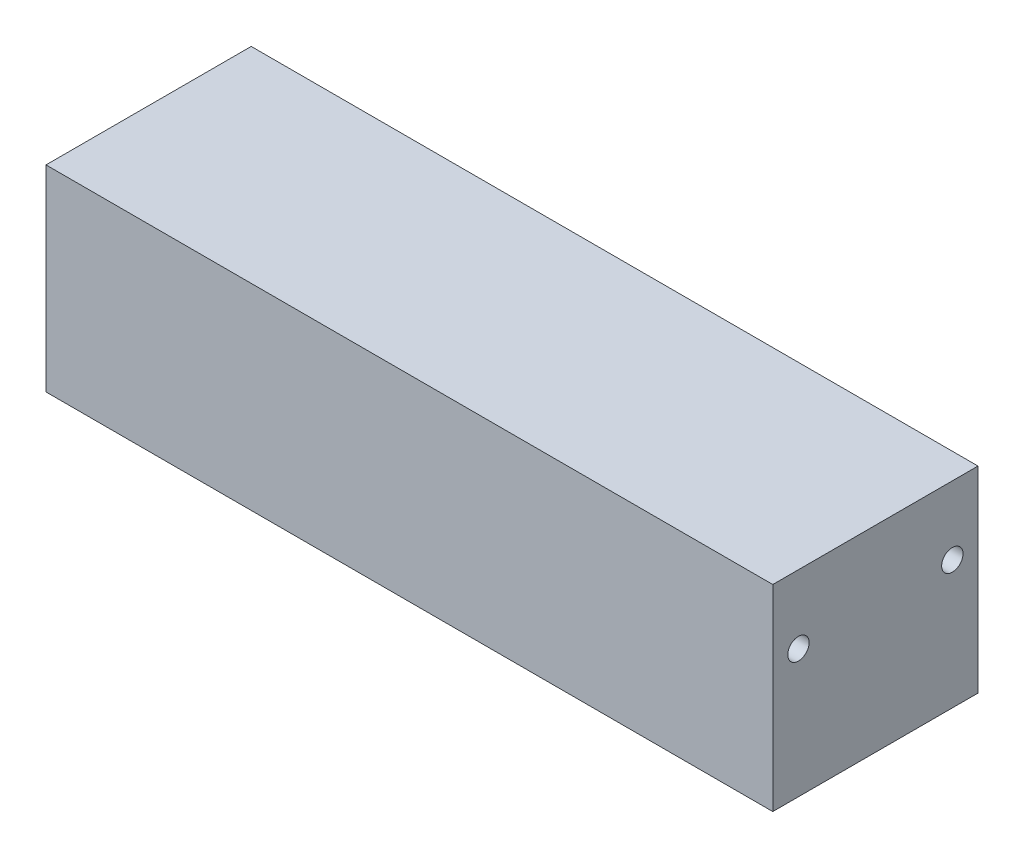
ISO-10303-21;
HEADER;
FILE_DESCRIPTION(('STEP AP214'),'2;1');
FILE_NAME('part.step','',(''),(''),'','','');
FILE_SCHEMA(('AUTOMOTIVE_DESIGN { 1 0 10303 214 1 1 1 1 }'));
ENDSEC;
DATA;
#1=APPLICATION_CONTEXT('core data for automotive mechanical design processes');
#2=APPLICATION_PROTOCOL_DEFINITION('international standard','automotive_design',2000,#1);
#3=PRODUCT_CONTEXT('',#1,'mechanical');
#4=PRODUCT('Part','Part','',(#3));
#5=PRODUCT_RELATED_PRODUCT_CATEGORY('part','',(#4));
#6=PRODUCT_DEFINITION_FORMATION('','',#4);
#7=PRODUCT_DEFINITION_CONTEXT('part definition',#1,'design');
#8=PRODUCT_DEFINITION('design','',#6,#7);
#9=PRODUCT_DEFINITION_SHAPE('','',#8);
#10=(LENGTH_UNIT() NAMED_UNIT(*) SI_UNIT(.MILLI.,.METRE.));
#11=(NAMED_UNIT(*) PLANE_ANGLE_UNIT() SI_UNIT($,.RADIAN.));
#12=(NAMED_UNIT(*) SI_UNIT($,.STERADIAN.) SOLID_ANGLE_UNIT());
#13=UNCERTAINTY_MEASURE_WITH_UNIT(LENGTH_MEASURE(1.E-05),#10,'distance_accuracy_value','');
#14=(GEOMETRIC_REPRESENTATION_CONTEXT(3) GLOBAL_UNCERTAINTY_ASSIGNED_CONTEXT((#13)) GLOBAL_UNIT_ASSIGNED_CONTEXT((#10,
#11,#12)) REPRESENTATION_CONTEXT('',''));
#15=CARTESIAN_POINT('',(0.,0.,0.));
#16=DIRECTION('',(0.,0.,1.));
#17=DIRECTION('',(1.,0.,0.));
#18=AXIS2_PLACEMENT_3D('',#15,#16,#17);
#19=CARTESIAN_POINT('',(-42.5,-11.5,24.));
#20=DIRECTION('',(1.,0.,0.));
#21=DIRECTION('',(0.,0.,-1.));
#22=AXIS2_PLACEMENT_3D('',#19,#20,#21);
#23=PLANE('',#22);
#24=CARTESIAN_POINT('',(-42.5,3.5,3.));
#25=DIRECTION('',(1.,0.,0.));
#26=DIRECTION('',(0.,0.,-1.));
#27=AXIS2_PLACEMENT_3D('',#24,#25,#26);
#28=CIRCLE('',#27,1.25);
#29=CARTESIAN_POINT('',(-42.5,3.5,1.75));
#30=VERTEX_POINT('',#29);
#31=EDGE_CURVE('E135',#30,#30,#28,.T.);
#32=ORIENTED_EDGE('',*,*,#31,.T.);
#33=EDGE_LOOP('',(#32));
#34=FACE_BOUND('',#33,.T.);
#35=CARTESIAN_POINT('',(-42.5,3.5,21.));
#36=DIRECTION('',(1.,0.,0.));
#37=DIRECTION('',(0.,0.,1.));
#38=AXIS2_PLACEMENT_3D('',#35,#36,#37);
#39=CIRCLE('',#38,1.25);
#40=CARTESIAN_POINT('',(-42.5,3.5,22.25));
#41=VERTEX_POINT('',#40);
#42=EDGE_CURVE('E138',#41,#41,#39,.T.);
#43=ORIENTED_EDGE('',*,*,#42,.T.);
#44=EDGE_LOOP('',(#43));
#45=FACE_BOUND('',#44,.T.);
#46=DIRECTION('',(0.,-1.,0.));
#47=VECTOR('',#46,1.);
#48=CARTESIAN_POINT('',(-42.5,-11.5,0.));
#49=LINE('',#48,#47);
#50=CARTESIAN_POINT('',(-42.5,11.5,0.));
#51=VERTEX_POINT('',#50);
#52=CARTESIAN_POINT('',(-42.5,-11.5,0.));
#53=VERTEX_POINT('',#52);
#54=EDGE_CURVE('E101',#51,#53,#49,.T.);
#55=ORIENTED_EDGE('',*,*,#54,.T.);
#56=DIRECTION('',(0.,0.,-1.));
#57=VECTOR('',#56,1.);
#58=CARTESIAN_POINT('',(-42.5,-11.5,24.));
#59=LINE('',#58,#57);
#60=CARTESIAN_POINT('',(-42.5,-11.5,24.));
#61=VERTEX_POINT('',#60);
#62=EDGE_CURVE('E43',#61,#53,#59,.T.);
#63=ORIENTED_EDGE('',*,*,#62,.F.);
#64=DIRECTION('',(0.,-1.,0.));
#65=VECTOR('',#64,1.);
#66=CARTESIAN_POINT('',(-42.5,-11.5,24.));
#67=LINE('',#66,#65);
#68=CARTESIAN_POINT('',(-42.5,11.5,24.));
#69=VERTEX_POINT('',#68);
#70=EDGE_CURVE('E87',#69,#61,#67,.T.);
#71=ORIENTED_EDGE('',*,*,#70,.F.);
#72=DIRECTION('',(0.,0.,-1.));
#73=VECTOR('',#72,1.);
#74=CARTESIAN_POINT('',(-42.5,11.5,24.));
#75=LINE('',#74,#73);
#76=EDGE_CURVE('E97',#69,#51,#75,.T.);
#77=ORIENTED_EDGE('',*,*,#76,.T.);
#78=EDGE_LOOP('',(#55,#63,#71,#77));
#79=FACE_BOUND('',#78,.T.);
#80=ADVANCED_FACE('F35',(#34,#45,#79),#23,.F.);
#81=CARTESIAN_POINT('',(42.5,-11.5,24.));
#82=DIRECTION('',(0.,1.,0.));
#83=DIRECTION('',(-1.,0.,0.));
#84=AXIS2_PLACEMENT_3D('',#81,#82,#83);
#85=PLANE('',#84);
#86=CARTESIAN_POINT('',(-34.5,-11.5,12.));
#87=DIRECTION('',(0.,1.,0.));
#88=DIRECTION('',(-1.,0.,0.));
#89=AXIS2_PLACEMENT_3D('',#86,#87,#88);
#90=CIRCLE('',#89,2.);
#91=CARTESIAN_POINT('',(-36.5,-11.5,12.));
#92=VERTEX_POINT('',#91);
#93=EDGE_CURVE('E11',#92,#92,#90,.F.);
#94=ORIENTED_EDGE('',*,*,#93,.F.);
#95=EDGE_LOOP('',(#94));
#96=FACE_BOUND('',#95,.T.);
#97=CARTESIAN_POINT('',(-25.,-11.5,12.));
#98=DIRECTION('',(0.,-1.,0.));
#99=DIRECTION('',(1.,0.,0.));
#100=AXIS2_PLACEMENT_3D('',#97,#98,#99);
#101=CIRCLE('',#100,1.25);
#102=CARTESIAN_POINT('',(-23.75,-11.5,12.));
#103=VERTEX_POINT('',#102);
#104=EDGE_CURVE('E165',#103,#103,#101,.T.);
#105=ORIENTED_EDGE('',*,*,#104,.F.);
#106=EDGE_LOOP('',(#105));
#107=FACE_BOUND('',#106,.T.);
#108=CARTESIAN_POINT('',(25.,-11.5,12.));
#109=DIRECTION('',(0.,-1.,0.));
#110=DIRECTION('',(1.,0.,0.));
#111=AXIS2_PLACEMENT_3D('',#108,#109,#110);
#112=CIRCLE('',#111,1.25);
#113=CARTESIAN_POINT('',(26.25,-11.5,12.));
#114=VERTEX_POINT('',#113);
#115=EDGE_CURVE('E152',#114,#114,#112,.T.);
#116=ORIENTED_EDGE('',*,*,#115,.F.);
#117=EDGE_LOOP('',(#116));
#118=FACE_BOUND('',#117,.T.);
#119=DIRECTION('',(1.,0.,0.));
#120=VECTOR('',#119,1.);
#121=CARTESIAN_POINT('',(42.5,-11.5,0.));
#122=LINE('',#121,#120);
#123=CARTESIAN_POINT('',(42.5,-11.5,0.));
#124=VERTEX_POINT('',#123);
#125=EDGE_CURVE('E92',#53,#124,#122,.T.);
#126=ORIENTED_EDGE('',*,*,#125,.T.);
#127=DIRECTION('',(0.,0.,-1.));
#128=VECTOR('',#127,1.);
#129=CARTESIAN_POINT('',(42.5,-11.5,24.));
#130=LINE('',#129,#128);
#131=CARTESIAN_POINT('',(42.5,-11.5,24.));
#132=VERTEX_POINT('',#131);
#133=EDGE_CURVE('E90',#132,#124,#130,.T.);
#134=ORIENTED_EDGE('',*,*,#133,.F.);
#135=DIRECTION('',(1.,0.,0.));
#136=VECTOR('',#135,1.);
#137=CARTESIAN_POINT('',(42.5,-11.5,24.));
#138=LINE('',#137,#136);
#139=EDGE_CURVE('E82',#61,#132,#138,.T.);
#140=ORIENTED_EDGE('',*,*,#139,.F.);
#141=ORIENTED_EDGE('',*,*,#62,.T.);
#142=EDGE_LOOP('',(#126,#134,#140,#141));
#143=FACE_BOUND('',#142,.T.);
#144=ADVANCED_FACE('F91',(#96,#107,#118,#143),#85,.F.);
#145=CARTESIAN_POINT('',(42.5,-11.5,24.));
#146=DIRECTION('',(-1.,0.,0.));
#147=DIRECTION('',(0.,0.,1.));
#148=AXIS2_PLACEMENT_3D('',#145,#146,#147);
#149=PLANE('',#148);
#150=CARTESIAN_POINT('',(42.5,3.5,3.));
#151=DIRECTION('',(1.,0.,0.));
#152=DIRECTION('',(0.,0.,-1.));
#153=AXIS2_PLACEMENT_3D('',#150,#151,#152);
#154=CIRCLE('',#153,1.25);
#155=CARTESIAN_POINT('',(42.5,3.5,1.75));
#156=VERTEX_POINT('',#155);
#157=EDGE_CURVE('E153',#156,#156,#154,.T.);
#158=ORIENTED_EDGE('',*,*,#157,.F.);
#159=EDGE_LOOP('',(#158));
#160=FACE_BOUND('',#159,.T.);
#161=CARTESIAN_POINT('',(42.5,3.5,21.));
#162=DIRECTION('',(1.,0.,0.));
#163=DIRECTION('',(0.,0.,1.));
#164=AXIS2_PLACEMENT_3D('',#161,#162,#163);
#165=CIRCLE('',#164,1.25);
#166=CARTESIAN_POINT('',(42.5,3.5,22.25));
#167=VERTEX_POINT('',#166);
#168=EDGE_CURVE('E159',#167,#167,#165,.T.);
#169=ORIENTED_EDGE('',*,*,#168,.F.);
#170=EDGE_LOOP('',(#169));
#171=FACE_BOUND('',#170,.T.);
#172=DIRECTION('',(0.,1.,0.));
#173=VECTOR('',#172,1.);
#174=CARTESIAN_POINT('',(42.5,-11.5,0.));
#175=LINE('',#174,#173);
#176=CARTESIAN_POINT('',(42.5,11.5,0.));
#177=VERTEX_POINT('',#176);
#178=EDGE_CURVE('E68',#124,#177,#175,.T.);
#179=ORIENTED_EDGE('',*,*,#178,.T.);
#180=DIRECTION('',(0.,0.,-1.));
#181=VECTOR('',#180,1.);
#182=CARTESIAN_POINT('',(42.5,11.5,24.));
#183=LINE('',#182,#181);
#184=CARTESIAN_POINT('',(42.5,11.5,24.));
#185=VERTEX_POINT('',#184);
#186=EDGE_CURVE('E93',#185,#177,#183,.T.);
#187=ORIENTED_EDGE('',*,*,#186,.F.);
#188=DIRECTION('',(0.,1.,0.));
#189=VECTOR('',#188,1.);
#190=CARTESIAN_POINT('',(42.5,-11.5,24.));
#191=LINE('',#190,#189);
#192=EDGE_CURVE('E85',#132,#185,#191,.T.);
#193=ORIENTED_EDGE('',*,*,#192,.F.);
#194=ORIENTED_EDGE('',*,*,#133,.T.);
#195=EDGE_LOOP('',(#179,#187,#193,#194));
#196=FACE_BOUND('',#195,.T.);
#197=ADVANCED_FACE('F95',(#160,#171,#196),#149,.F.);
#198=CARTESIAN_POINT('',(42.5,11.5,24.));
#199=DIRECTION('',(0.,-1.,0.));
#200=DIRECTION('',(1.,0.,0.));
#201=AXIS2_PLACEMENT_3D('',#198,#199,#200);
#202=PLANE('',#201);
#203=DIRECTION('',(-1.,0.,0.));
#204=VECTOR('',#203,1.);
#205=CARTESIAN_POINT('',(42.5,11.5,0.));
#206=LINE('',#205,#204);
#207=EDGE_CURVE('E74',#177,#51,#206,.T.);
#208=ORIENTED_EDGE('',*,*,#207,.T.);
#209=ORIENTED_EDGE('',*,*,#76,.F.);
#210=DIRECTION('',(-1.,0.,0.));
#211=VECTOR('',#210,1.);
#212=CARTESIAN_POINT('',(42.5,11.5,24.));
#213=LINE('',#212,#211);
#214=EDGE_CURVE('E51',#185,#69,#213,.T.);
#215=ORIENTED_EDGE('',*,*,#214,.F.);
#216=ORIENTED_EDGE('',*,*,#186,.T.);
#217=EDGE_LOOP('',(#208,#209,#215,#216));
#218=FACE_BOUND('',#217,.T.);
#219=ADVANCED_FACE('F123',(#218),#202,.F.);
#220=CARTESIAN_POINT('',(0.,0.,24.));
#221=DIRECTION('',(0.,0.,1.));
#222=DIRECTION('',(1.,0.,0.));
#223=AXIS2_PLACEMENT_3D('',#220,#221,#222);
#224=PLANE('',#223);
#225=ORIENTED_EDGE('',*,*,#70,.T.);
#226=ORIENTED_EDGE('',*,*,#139,.T.);
#227=ORIENTED_EDGE('',*,*,#192,.T.);
#228=ORIENTED_EDGE('',*,*,#214,.T.);
#229=EDGE_LOOP('',(#225,#226,#227,#228));
#230=FACE_BOUND('',#229,.T.);
#231=ADVANCED_FACE('F83',(#230),#224,.T.);
#232=CARTESIAN_POINT('',(0.,0.,0.));
#233=DIRECTION('',(0.,0.,1.));
#234=DIRECTION('',(1.,0.,0.));
#235=AXIS2_PLACEMENT_3D('',#232,#233,#234);
#236=PLANE('',#235);
#237=ORIENTED_EDGE('',*,*,#54,.F.);
#238=ORIENTED_EDGE('',*,*,#207,.F.);
#239=ORIENTED_EDGE('',*,*,#178,.F.);
#240=ORIENTED_EDGE('',*,*,#125,.F.);
#241=EDGE_LOOP('',(#237,#238,#239,#240));
#242=FACE_BOUND('',#241,.T.);
#243=ADVANCED_FACE('F112',(#242),#236,.F.);
#244=CARTESIAN_POINT('',(25.,-7.5,12.));
#245=DIRECTION('',(0.,-1.,0.));
#246=DIRECTION('',(1.,0.,0.));
#247=AXIS2_PLACEMENT_3D('',#244,#245,#246);
#248=CYLINDRICAL_SURFACE('',#247,1.25);
#249=CARTESIAN_POINT('',(25.,-7.5,12.));
#250=DIRECTION('',(0.,-1.,0.));
#251=DIRECTION('',(1.,0.,0.));
#252=AXIS2_PLACEMENT_3D('',#249,#250,#251);
#253=CIRCLE('',#252,1.25);
#254=CARTESIAN_POINT('',(26.25,-7.5,12.));
#255=VERTEX_POINT('',#254);
#256=EDGE_CURVE('E168',#255,#255,#253,.T.);
#257=ORIENTED_EDGE('',*,*,#256,.F.);
#258=EDGE_LOOP('',(#257));
#259=FACE_BOUND('',#258,.T.);
#260=ORIENTED_EDGE('',*,*,#115,.T.);
#261=EDGE_LOOP('',(#260));
#262=FACE_BOUND('',#261,.T.);
#263=ADVANCED_FACE('F114',(#259,#262),#248,.F.);
#264=CARTESIAN_POINT('',(25.,-7.5,12.));
#265=DIRECTION('',(0.,-1.,0.));
#266=DIRECTION('',(1.,0.,0.));
#267=AXIS2_PLACEMENT_3D('',#264,#265,#266);
#268=PLANE('',#267);
#269=ORIENTED_EDGE('',*,*,#256,.T.);
#270=EDGE_LOOP('',(#269));
#271=FACE_BOUND('',#270,.T.);
#272=ADVANCED_FACE('F120',(#271),#268,.T.);
#273=CARTESIAN_POINT('',(-25.,-7.50000000000001,12.));
#274=DIRECTION('',(0.,-1.,0.));
#275=DIRECTION('',(1.,0.,0.));
#276=AXIS2_PLACEMENT_3D('',#273,#274,#275);
#277=CYLINDRICAL_SURFACE('',#276,1.25);
#278=CARTESIAN_POINT('',(-25.,-7.50000000000001,12.));
#279=DIRECTION('',(0.,-1.,0.));
#280=DIRECTION('',(1.,0.,0.));
#281=AXIS2_PLACEMENT_3D('',#278,#279,#280);
#282=CIRCLE('',#281,1.25);
#283=CARTESIAN_POINT('',(-23.75,-7.50000000000001,12.));
#284=VERTEX_POINT('',#283);
#285=EDGE_CURVE('E104',#284,#284,#282,.T.);
#286=ORIENTED_EDGE('',*,*,#285,.F.);
#287=EDGE_LOOP('',(#286));
#288=FACE_BOUND('',#287,.T.);
#289=ORIENTED_EDGE('',*,*,#104,.T.);
#290=EDGE_LOOP('',(#289));
#291=FACE_BOUND('',#290,.T.);
#292=ADVANCED_FACE('F178',(#288,#291),#277,.F.);
#293=CARTESIAN_POINT('',(-25.,-7.50000000000001,12.));
#294=DIRECTION('',(0.,-1.,0.));
#295=DIRECTION('',(1.,0.,0.));
#296=AXIS2_PLACEMENT_3D('',#293,#294,#295);
#297=PLANE('',#296);
#298=ORIENTED_EDGE('',*,*,#285,.T.);
#299=EDGE_LOOP('',(#298));
#300=FACE_BOUND('',#299,.T.);
#301=ADVANCED_FACE('F183',(#300),#297,.T.);
#302=CARTESIAN_POINT('',(38.5,3.5,21.));
#303=DIRECTION('',(1.,0.,0.));
#304=DIRECTION('',(0.,0.,-1.));
#305=AXIS2_PLACEMENT_3D('',#302,#303,#304);
#306=CYLINDRICAL_SURFACE('',#305,1.25);
#307=CARTESIAN_POINT('',(38.5,3.5,21.));
#308=DIRECTION('',(1.,0.,0.));
#309=DIRECTION('',(0.,0.,1.));
#310=AXIS2_PLACEMENT_3D('',#307,#308,#309);
#311=CIRCLE('',#310,1.25);
#312=CARTESIAN_POINT('',(38.5,3.5,22.25));
#313=VERTEX_POINT('',#312);
#314=EDGE_CURVE('E156',#313,#313,#311,.T.);
#315=ORIENTED_EDGE('',*,*,#314,.F.);
#316=EDGE_LOOP('',(#315));
#317=FACE_BOUND('',#316,.T.);
#318=ORIENTED_EDGE('',*,*,#168,.T.);
#319=EDGE_LOOP('',(#318));
#320=FACE_BOUND('',#319,.T.);
#321=ADVANCED_FACE('F189',(#317,#320),#306,.F.);
#322=CARTESIAN_POINT('',(38.5,3.5,21.));
#323=DIRECTION('',(-1.,0.,0.));
#324=DIRECTION('',(0.,0.,1.));
#325=AXIS2_PLACEMENT_3D('',#322,#323,#324);
#326=PLANE('',#325);
#327=ORIENTED_EDGE('',*,*,#314,.T.);
#328=EDGE_LOOP('',(#327));
#329=FACE_BOUND('',#328,.T.);
#330=ADVANCED_FACE('F193',(#329),#326,.F.);
#331=CARTESIAN_POINT('',(38.5,3.5,3.));
#332=DIRECTION('',(1.,0.,0.));
#333=DIRECTION('',(0.,0.,-1.));
#334=AXIS2_PLACEMENT_3D('',#331,#332,#333);
#335=CYLINDRICAL_SURFACE('',#334,1.25);
#336=CARTESIAN_POINT('',(38.5,3.5,3.));
#337=DIRECTION('',(1.,0.,0.));
#338=DIRECTION('',(0.,0.,-1.));
#339=AXIS2_PLACEMENT_3D('',#336,#337,#338);
#340=CIRCLE('',#339,1.25);
#341=CARTESIAN_POINT('',(38.5,3.5,1.75));
#342=VERTEX_POINT('',#341);
#343=EDGE_CURVE('E149',#342,#342,#340,.T.);
#344=ORIENTED_EDGE('',*,*,#343,.F.);
#345=EDGE_LOOP('',(#344));
#346=FACE_BOUND('',#345,.T.);
#347=ORIENTED_EDGE('',*,*,#157,.T.);
#348=EDGE_LOOP('',(#347));
#349=FACE_BOUND('',#348,.T.);
#350=ADVANCED_FACE('F197',(#346,#349),#335,.F.);
#351=CARTESIAN_POINT('',(38.5,3.5,3.));
#352=DIRECTION('',(1.,0.,0.));
#353=DIRECTION('',(0.,0.,-1.));
#354=AXIS2_PLACEMENT_3D('',#351,#352,#353);
#355=PLANE('',#354);
#356=ORIENTED_EDGE('',*,*,#343,.T.);
#357=EDGE_LOOP('',(#356));
#358=FACE_BOUND('',#357,.T.);
#359=ADVANCED_FACE('F201',(#358),#355,.T.);
#360=CARTESIAN_POINT('',(-38.5,3.5,21.));
#361=DIRECTION('',(-1.,0.,0.));
#362=DIRECTION('',(0.,0.,1.));
#363=AXIS2_PLACEMENT_3D('',#360,#361,#362);
#364=CYLINDRICAL_SURFACE('',#363,1.25);
#365=CARTESIAN_POINT('',(-38.5,3.5,21.));
#366=DIRECTION('',(1.,0.,0.));
#367=DIRECTION('',(0.,0.,1.));
#368=AXIS2_PLACEMENT_3D('',#365,#366,#367);
#369=CIRCLE('',#368,1.25);
#370=CARTESIAN_POINT('',(-38.5,3.5,22.25));
#371=VERTEX_POINT('',#370);
#372=EDGE_CURVE('E140',#371,#371,#369,.T.);
#373=ORIENTED_EDGE('',*,*,#372,.T.);
#374=EDGE_LOOP('',(#373));
#375=FACE_BOUND('',#374,.T.);
#376=ORIENTED_EDGE('',*,*,#42,.F.);
#377=EDGE_LOOP('',(#376));
#378=FACE_BOUND('',#377,.T.);
#379=ADVANCED_FACE('F205',(#375,#378),#364,.F.);
#380=CARTESIAN_POINT('',(-38.5,3.5,21.));
#381=DIRECTION('',(1.,0.,0.));
#382=DIRECTION('',(0.,0.,1.));
#383=AXIS2_PLACEMENT_3D('',#380,#381,#382);
#384=PLANE('',#383);
#385=ORIENTED_EDGE('',*,*,#372,.F.);
#386=EDGE_LOOP('',(#385));
#387=FACE_BOUND('',#386,.T.);
#388=ADVANCED_FACE('F209',(#387),#384,.F.);
#389=CARTESIAN_POINT('',(-38.5,3.5,3.));
#390=DIRECTION('',(-1.,0.,0.));
#391=DIRECTION('',(0.,0.,1.));
#392=AXIS2_PLACEMENT_3D('',#389,#390,#391);
#393=CYLINDRICAL_SURFACE('',#392,1.25);
#394=CARTESIAN_POINT('',(-38.5,3.5,3.));
#395=DIRECTION('',(1.,0.,0.));
#396=DIRECTION('',(0.,0.,-1.));
#397=AXIS2_PLACEMENT_3D('',#394,#395,#396);
#398=CIRCLE('',#397,1.25);
#399=CARTESIAN_POINT('',(-38.5,3.5,1.75));
#400=VERTEX_POINT('',#399);
#401=EDGE_CURVE('E162',#400,#400,#398,.T.);
#402=ORIENTED_EDGE('',*,*,#401,.T.);
#403=EDGE_LOOP('',(#402));
#404=FACE_BOUND('',#403,.T.);
#405=ORIENTED_EDGE('',*,*,#31,.F.);
#406=EDGE_LOOP('',(#405));
#407=FACE_BOUND('',#406,.T.);
#408=ADVANCED_FACE('F213',(#404,#407),#393,.F.);
#409=CARTESIAN_POINT('',(-38.5,3.5,3.));
#410=DIRECTION('',(-1.,0.,0.));
#411=DIRECTION('',(0.,0.,-1.));
#412=AXIS2_PLACEMENT_3D('',#409,#410,#411);
#413=PLANE('',#412);
#414=ORIENTED_EDGE('',*,*,#401,.F.);
#415=EDGE_LOOP('',(#414));
#416=FACE_BOUND('',#415,.T.);
#417=ADVANCED_FACE('F217',(#416),#413,.T.);
#418=CARTESIAN_POINT('',(-34.5,-21.5,12.));
#419=DIRECTION('',(0.,1.,0.));
#420=DIRECTION('',(-1.,0.,0.));
#421=AXIS2_PLACEMENT_3D('',#418,#419,#420);
#422=CYLINDRICAL_SURFACE('',#421,2.);
#423=CARTESIAN_POINT('',(-34.5,-21.5,12.));
#424=DIRECTION('',(0.,-1.,0.));
#425=DIRECTION('',(1.,0.,0.));
#426=AXIS2_PLACEMENT_3D('',#423,#424,#425);
#427=CIRCLE('',#426,2.);
#428=CARTESIAN_POINT('',(-32.5,-21.5,12.));
#429=VERTEX_POINT('',#428);
#430=EDGE_CURVE('E141',#429,#429,#427,.T.);
#431=ORIENTED_EDGE('',*,*,#430,.F.);
#432=EDGE_LOOP('',(#431));
#433=FACE_BOUND('',#432,.T.);
#434=ORIENTED_EDGE('',*,*,#93,.T.);
#435=EDGE_LOOP('',(#434));
#436=FACE_BOUND('',#435,.T.);
#437=ADVANCED_FACE('F221',(#433,#436),#422,.T.);
#438=CARTESIAN_POINT('',(-34.5,-21.5,12.));
#439=DIRECTION('',(0.,-1.,0.));
#440=DIRECTION('',(1.,0.,0.));
#441=AXIS2_PLACEMENT_3D('',#438,#439,#440);
#442=PLANE('',#441);
#443=ORIENTED_EDGE('',*,*,#430,.T.);
#444=EDGE_LOOP('',(#443));
#445=FACE_BOUND('',#444,.T.);
#446=ADVANCED_FACE('F225',(#445),#442,.T.);
#447=CLOSED_SHELL('',(#80,#144,#197,#219,#231,#243,#263,#272,#292,#301,#321,#330,#350,#359,#379,
#388,#408,#417,#437,#446));
#448=MANIFOLD_SOLID_BREP('B2',#447);
#449=ADVANCED_BREP_SHAPE_REPRESENTATION('',(#18,#448),#14);
#450=SHAPE_DEFINITION_REPRESENTATION(#9,#449);
ENDSEC;
END-ISO-10303-21;
